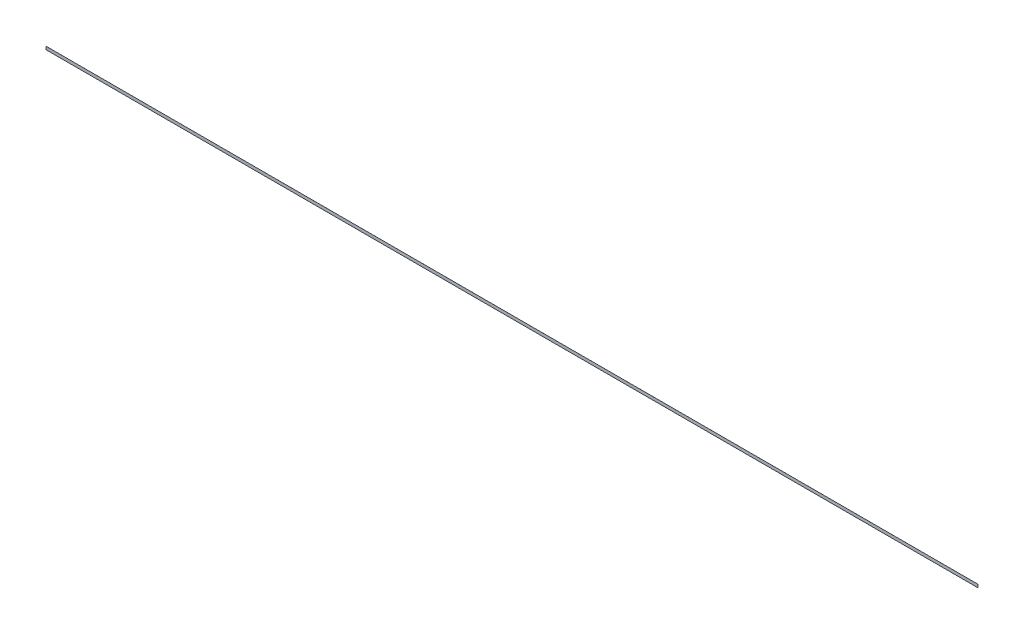
ISO-10303-21;
HEADER;
FILE_DESCRIPTION(('STEP AP214'),'2;1');
FILE_NAME('part.step','',(''),(''),'','','');
FILE_SCHEMA(('AUTOMOTIVE_DESIGN { 1 0 10303 214 1 1 1 1 }'));
ENDSEC;
DATA;
#1=APPLICATION_CONTEXT('core data for automotive mechanical design processes');
#2=APPLICATION_PROTOCOL_DEFINITION('international standard','automotive_design',2000,#1);
#3=PRODUCT_CONTEXT('',#1,'mechanical');
#4=PRODUCT('Part','Part','',(#3));
#5=PRODUCT_RELATED_PRODUCT_CATEGORY('part','',(#4));
#6=PRODUCT_DEFINITION_FORMATION('','',#4);
#7=PRODUCT_DEFINITION_CONTEXT('part definition',#1,'design');
#8=PRODUCT_DEFINITION('design','',#6,#7);
#9=PRODUCT_DEFINITION_SHAPE('','',#8);
#10=(LENGTH_UNIT() NAMED_UNIT(*) SI_UNIT(.MILLI.,.METRE.));
#11=(NAMED_UNIT(*) PLANE_ANGLE_UNIT() SI_UNIT($,.RADIAN.));
#12=(NAMED_UNIT(*) SI_UNIT($,.STERADIAN.) SOLID_ANGLE_UNIT());
#13=UNCERTAINTY_MEASURE_WITH_UNIT(LENGTH_MEASURE(1.E-05),#10,'distance_accuracy_value','');
#14=(GEOMETRIC_REPRESENTATION_CONTEXT(3) GLOBAL_UNCERTAINTY_ASSIGNED_CONTEXT((#13)) GLOBAL_UNIT_ASSIGNED_CONTEXT((#10,
#11,#12)) REPRESENTATION_CONTEXT('',''));
#15=CARTESIAN_POINT('',(0.,0.,0.));
#16=DIRECTION('',(0.,0.,1.));
#17=DIRECTION('',(1.,0.,0.));
#18=AXIS2_PLACEMENT_3D('',#15,#16,#17);
#19=CARTESIAN_POINT('',(7.,-8.74,0.002));
#20=DIRECTION('',(-1.,0.,0.));
#21=DIRECTION('',(0.,0.,1.));
#22=AXIS2_PLACEMENT_3D('',#19,#20,#21);
#23=PLANE('',#22);
#24=DIRECTION('',(0.,1.,0.));
#25=VECTOR('',#24,1.);
#26=CARTESIAN_POINT('',(7.,-8.74,0.));
#27=LINE('',#26,#25);
#28=CARTESIAN_POINT('',(7.,-8.74,0.));
#29=VERTEX_POINT('',#28);
#30=CARTESIAN_POINT('',(7.,-8.24,0.));
#31=VERTEX_POINT('',#30);
#32=EDGE_CURVE('E21',#29,#31,#27,.T.);
#33=ORIENTED_EDGE('',*,*,#32,.F.);
#34=DIRECTION('',(0.,0.,-1.));
#35=VECTOR('',#34,1.);
#36=CARTESIAN_POINT('',(7.,-8.74,0.002));
#37=LINE('',#36,#35);
#38=CARTESIAN_POINT('',(7.,-8.74,0.002));
#39=VERTEX_POINT('',#38);
#40=EDGE_CURVE('E58',#39,#29,#37,.T.);
#41=ORIENTED_EDGE('',*,*,#40,.F.);
#42=DIRECTION('',(0.,1.,0.));
#43=VECTOR('',#42,1.);
#44=CARTESIAN_POINT('',(7.,-8.74,0.002));
#45=LINE('',#44,#43);
#46=CARTESIAN_POINT('',(7.,-8.24,0.002));
#47=VERTEX_POINT('',#46);
#48=EDGE_CURVE('E66',#39,#47,#45,.T.);
#49=ORIENTED_EDGE('',*,*,#48,.T.);
#50=DIRECTION('',(0.,0.,-1.));
#51=VECTOR('',#50,1.);
#52=CARTESIAN_POINT('',(7.,-8.24,0.002));
#53=LINE('',#52,#51);
#54=EDGE_CURVE('E73',#47,#31,#53,.T.);
#55=ORIENTED_EDGE('',*,*,#54,.T.);
#56=EDGE_LOOP('',(#33,#41,#49,#55));
#57=FACE_BOUND('',#56,.T.);
#58=ADVANCED_FACE('F17',(#57),#23,.T.);
#59=CARTESIAN_POINT('',(7.,-8.24,0.002));
#60=DIRECTION('',(0.,1.,0.));
#61=DIRECTION('',(-1.,0.,0.));
#62=AXIS2_PLACEMENT_3D('',#59,#60,#61);
#63=PLANE('',#62);
#64=DIRECTION('',(1.,0.,0.));
#65=VECTOR('',#64,1.);
#66=CARTESIAN_POINT('',(7.,-8.24,0.));
#67=LINE('',#66,#65);
#68=CARTESIAN_POINT('',(157.,-8.24,0.));
#69=VERTEX_POINT('',#68);
#70=EDGE_CURVE('E90',#31,#69,#67,.T.);
#71=ORIENTED_EDGE('',*,*,#70,.F.);
#72=ORIENTED_EDGE('',*,*,#54,.F.);
#73=DIRECTION('',(1.,0.,0.));
#74=VECTOR('',#73,1.);
#75=CARTESIAN_POINT('',(7.,-8.24,0.002));
#76=LINE('',#75,#74);
#77=CARTESIAN_POINT('',(157.,-8.24,0.002));
#78=VERTEX_POINT('',#77);
#79=EDGE_CURVE('E106',#47,#78,#76,.T.);
#80=ORIENTED_EDGE('',*,*,#79,.T.);
#81=DIRECTION('',(0.,0.,-1.));
#82=VECTOR('',#81,1.);
#83=CARTESIAN_POINT('',(157.,-8.24,0.002));
#84=LINE('',#83,#82);
#85=EDGE_CURVE('E111',#78,#69,#84,.T.);
#86=ORIENTED_EDGE('',*,*,#85,.T.);
#87=EDGE_LOOP('',(#71,#72,#80,#86));
#88=FACE_BOUND('',#87,.T.);
#89=ADVANCED_FACE('F92',(#88),#63,.T.);
#90=CARTESIAN_POINT('',(157.,-8.24,0.002));
#91=DIRECTION('',(1.,0.,0.));
#92=DIRECTION('',(0.,0.,-1.));
#93=AXIS2_PLACEMENT_3D('',#90,#91,#92);
#94=PLANE('',#93);
#95=DIRECTION('',(0.,-1.,0.));
#96=VECTOR('',#95,1.);
#97=CARTESIAN_POINT('',(157.,-8.24,0.));
#98=LINE('',#97,#96);
#99=CARTESIAN_POINT('',(157.,-8.74,0.));
#100=VERTEX_POINT('',#99);
#101=EDGE_CURVE('E70',#69,#100,#98,.T.);
#102=ORIENTED_EDGE('',*,*,#101,.F.);
#103=ORIENTED_EDGE('',*,*,#85,.F.);
#104=DIRECTION('',(0.,-1.,0.));
#105=VECTOR('',#104,1.);
#106=CARTESIAN_POINT('',(157.,-8.24,0.002));
#107=LINE('',#106,#105);
#108=CARTESIAN_POINT('',(157.,-8.74,0.002));
#109=VERTEX_POINT('',#108);
#110=EDGE_CURVE('E125',#78,#109,#107,.T.);
#111=ORIENTED_EDGE('',*,*,#110,.T.);
#112=DIRECTION('',(0.,0.,-1.));
#113=VECTOR('',#112,1.);
#114=CARTESIAN_POINT('',(157.,-8.74,0.002));
#115=LINE('',#114,#113);
#116=EDGE_CURVE('E37',#109,#100,#115,.T.);
#117=ORIENTED_EDGE('',*,*,#116,.T.);
#118=EDGE_LOOP('',(#102,#103,#111,#117));
#119=FACE_BOUND('',#118,.T.);
#120=ADVANCED_FACE('F97',(#119),#94,.T.);
#121=CARTESIAN_POINT('',(157.,-8.74,0.002));
#122=DIRECTION('',(0.,-1.,0.));
#123=DIRECTION('',(1.,0.,0.));
#124=AXIS2_PLACEMENT_3D('',#121,#122,#123);
#125=PLANE('',#124);
#126=DIRECTION('',(-1.,0.,0.));
#127=VECTOR('',#126,1.);
#128=CARTESIAN_POINT('',(157.,-8.74,0.));
#129=LINE('',#128,#127);
#130=EDGE_CURVE('E28',#100,#29,#129,.T.);
#131=ORIENTED_EDGE('',*,*,#130,.F.);
#132=ORIENTED_EDGE('',*,*,#116,.F.);
#133=DIRECTION('',(-1.,0.,0.));
#134=VECTOR('',#133,1.);
#135=CARTESIAN_POINT('',(157.,-8.74,0.002));
#136=LINE('',#135,#134);
#137=EDGE_CURVE('E11',#109,#39,#136,.T.);
#138=ORIENTED_EDGE('',*,*,#137,.T.);
#139=ORIENTED_EDGE('',*,*,#40,.T.);
#140=EDGE_LOOP('',(#131,#132,#138,#139));
#141=FACE_BOUND('',#140,.T.);
#142=ADVANCED_FACE('F61',(#141),#125,.T.);
#143=CARTESIAN_POINT('',(0.,0.,0.002));
#144=DIRECTION('',(0.,0.,-1.));
#145=DIRECTION('',(-1.,0.,0.));
#146=AXIS2_PLACEMENT_3D('',#143,#144,#145);
#147=PLANE('',#146);
#148=ORIENTED_EDGE('',*,*,#48,.F.);
#149=ORIENTED_EDGE('',*,*,#137,.F.);
#150=ORIENTED_EDGE('',*,*,#110,.F.);
#151=ORIENTED_EDGE('',*,*,#79,.F.);
#152=EDGE_LOOP('',(#148,#149,#150,#151));
#153=FACE_BOUND('',#152,.T.);
#154=ADVANCED_FACE('F135',(#153),#147,.F.);
#155=CARTESIAN_POINT('',(0.,0.,0.));
#156=DIRECTION('',(0.,0.,-1.));
#157=DIRECTION('',(-1.,0.,0.));
#158=AXIS2_PLACEMENT_3D('',#155,#156,#157);
#159=PLANE('',#158);
#160=ORIENTED_EDGE('',*,*,#32,.T.);
#161=ORIENTED_EDGE('',*,*,#70,.T.);
#162=ORIENTED_EDGE('',*,*,#101,.T.);
#163=ORIENTED_EDGE('',*,*,#130,.T.);
#164=EDGE_LOOP('',(#160,#161,#162,#163));
#165=FACE_BOUND('',#164,.T.);
#166=ADVANCED_FACE('F19',(#165),#159,.T.);
#167=CLOSED_SHELL('',(#58,#89,#120,#142,#154,#166));
#168=MANIFOLD_SOLID_BREP('B1',#167);
#169=ADVANCED_BREP_SHAPE_REPRESENTATION('',(#18,#168),#14);
#170=SHAPE_DEFINITION_REPRESENTATION(#9,#169);
ENDSEC;
END-ISO-10303-21;
